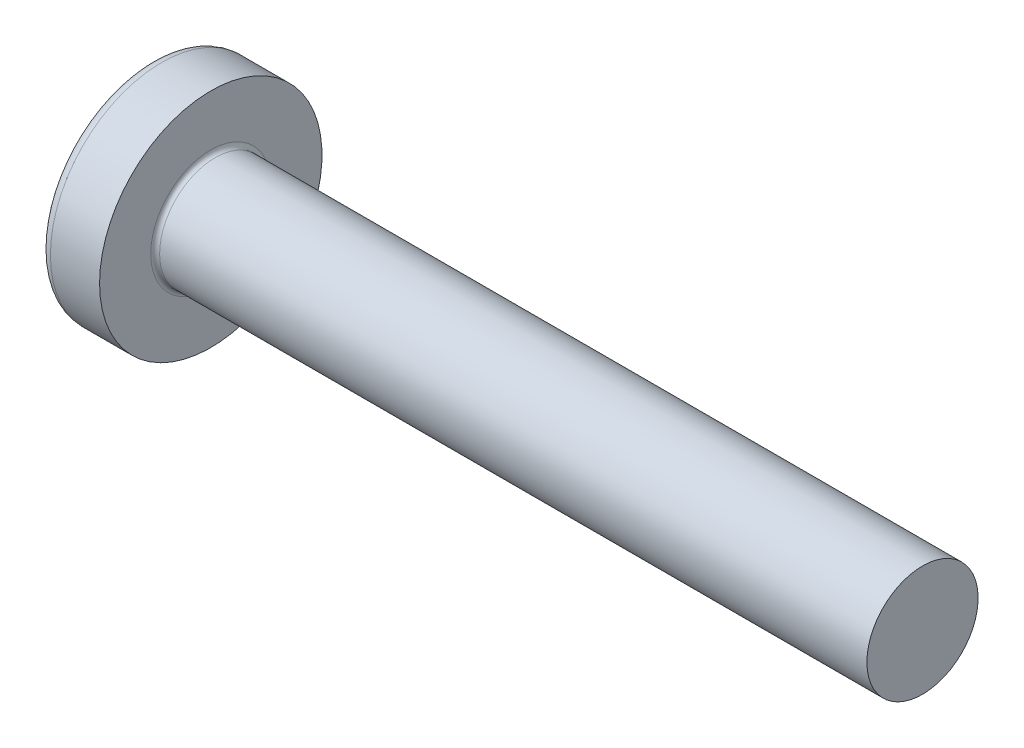
ISO-10303-21;
HEADER;
FILE_DESCRIPTION(('STEP AP214'),'2;1');
FILE_NAME('part.step','',(''),(''),'','','');
FILE_SCHEMA(('AUTOMOTIVE_DESIGN { 1 0 10303 214 1 1 1 1 }'));
ENDSEC;
DATA;
#1=APPLICATION_CONTEXT('core data for automotive mechanical design processes');
#2=APPLICATION_PROTOCOL_DEFINITION('international standard','automotive_design',2000,#1);
#3=PRODUCT_CONTEXT('',#1,'mechanical');
#4=PRODUCT('Part','Part','',(#3));
#5=PRODUCT_RELATED_PRODUCT_CATEGORY('part','',(#4));
#6=PRODUCT_DEFINITION_FORMATION('','',#4);
#7=PRODUCT_DEFINITION_CONTEXT('part definition',#1,'design');
#8=PRODUCT_DEFINITION('design','',#6,#7);
#9=PRODUCT_DEFINITION_SHAPE('','',#8);
#10=(LENGTH_UNIT() NAMED_UNIT(*) SI_UNIT(.MILLI.,.METRE.));
#11=(NAMED_UNIT(*) PLANE_ANGLE_UNIT() SI_UNIT($,.RADIAN.));
#12=(NAMED_UNIT(*) SI_UNIT($,.STERADIAN.) SOLID_ANGLE_UNIT());
#13=UNCERTAINTY_MEASURE_WITH_UNIT(LENGTH_MEASURE(1.E-05),#10,'distance_accuracy_value','');
#14=(GEOMETRIC_REPRESENTATION_CONTEXT(3) GLOBAL_UNCERTAINTY_ASSIGNED_CONTEXT((#13)) GLOBAL_UNIT_ASSIGNED_CONTEXT((#10,
#11,#12)) REPRESENTATION_CONTEXT('',''));
#15=CARTESIAN_POINT('',(0.,0.,0.));
#16=DIRECTION('',(0.,0.,1.));
#17=DIRECTION('',(1.,0.,0.));
#18=AXIS2_PLACEMENT_3D('',#15,#16,#17);
#19=CARTESIAN_POINT('',(4.,0.,0.));
#20=DIRECTION('',(-1.,0.,0.));
#21=DIRECTION('',(0.,1.,0.));
#22=AXIS2_PLACEMENT_3D('',#19,#20,#21);
#23=SPHERICAL_SURFACE('',#22,4.);
#24=CARTESIAN_POINT('',(0.803195914613464,0.,0.));
#25=DIRECTION('',(-1.,0.,0.));
#26=DIRECTION('',(0.,0.,1.));
#27=AXIS2_PLACEMENT_3D('',#24,#25,#26);
#28=CIRCLE('',#27,2.40425531914894);
#29=CARTESIAN_POINT('',(0.803195914613464,0.,2.40425531914894));
#30=VERTEX_POINT('',#29);
#31=EDGE_CURVE('E236',#30,#30,#28,.T.);
#32=ORIENTED_EDGE('',*,*,#31,.T.);
#33=EDGE_LOOP('',(#32));
#34=FACE_BOUND('',#33,.T.);
#35=CARTESIAN_POINT('',(0.0543400780062932,0.,0.));
#36=DIRECTION('',(1.,0.,0.));
#37=DIRECTION('',(0.,0.,-1.));
#38=AXIS2_PLACEMENT_3D('',#35,#36,#37);
#39=CIRCLE('',#38,0.657090389499513);
#40=CARTESIAN_POINT('',(0.0543400780062942,-0.369999999999998,-0.54301729251712));
#41=VERTEX_POINT('',#40);
#42=CARTESIAN_POINT('',(0.0543400780062936,-0.543017292517118,-0.37));
#43=VERTEX_POINT('',#42);
#44=EDGE_CURVE('E372',#41,#43,#39,.F.);
#45=ORIENTED_EDGE('',*,*,#44,.F.);
#46=CARTESIAN_POINT('',(4.,-0.37,0.));
#47=DIRECTION('',(0.,1.,0.));
#48=DIRECTION('',(0.,0.,1.));
#49=AXIS2_PLACEMENT_3D('',#46,#47,#48);
#50=CIRCLE('',#49,3.98285073785097);
#51=CARTESIAN_POINT('',(0.201999107564768,-0.369999999999996,-1.19928696360011));
#52=VERTEX_POINT('',#51);
#53=EDGE_CURVE('E298',#52,#41,#50,.T.);
#54=ORIENTED_EDGE('',*,*,#53,.F.);
#55=CARTESIAN_POINT('',(3.72274316107109,0.,0.556091207572131));
#56=DIRECTION('',(0.446197800778958,0.,-0.894934367749961));
#57=DIRECTION('',(-0.89493436774996,0.,-0.446197800778958));
#58=AXIS2_PLACEMENT_3D('',#55,#56,#57);
#59=CIRCLE('',#58,3.95144166275147);
#60=CARTESIAN_POINT('',(0.201999107564768,0.370000000000004,-1.19928696360011));
#61=VERTEX_POINT('',#60);
#62=EDGE_CURVE('E270',#52,#61,#59,.T.);
#63=ORIENTED_EDGE('',*,*,#62,.T.);
#64=CARTESIAN_POINT('',(4.,0.37,0.));
#65=DIRECTION('',(0.,-1.,0.));
#66=DIRECTION('',(0.,0.,-1.));
#67=AXIS2_PLACEMENT_3D('',#64,#65,#66);
#68=CIRCLE('',#67,3.98285073785097);
#69=CARTESIAN_POINT('',(0.0543400780062943,0.370000000000002,-0.543017292517117));
#70=VERTEX_POINT('',#69);
#71=EDGE_CURVE('E325',#70,#61,#68,.T.);
#72=ORIENTED_EDGE('',*,*,#71,.F.);
#73=CARTESIAN_POINT('',(0.0543400780062936,0.543017292517117,-0.37));
#74=VERTEX_POINT('',#73);
#75=EDGE_CURVE('E391',#74,#70,#39,.F.);
#76=ORIENTED_EDGE('',*,*,#75,.F.);
#77=CARTESIAN_POINT('',(4.,0.,-0.37));
#78=DIRECTION('',(0.,0.,1.));
#79=DIRECTION('',(1.,0.,0.));
#80=AXIS2_PLACEMENT_3D('',#77,#78,#79);
#81=CIRCLE('',#80,3.98285073785097);
#82=CARTESIAN_POINT('',(0.201999107564767,1.19928696360011,-0.37));
#83=VERTEX_POINT('',#82);
#84=EDGE_CURVE('E264',#83,#74,#81,.T.);
#85=ORIENTED_EDGE('',*,*,#84,.F.);
#86=CARTESIAN_POINT('',(3.72274316107109,-0.556091207572131,0.));
#87=DIRECTION('',(0.446197800778958,0.89493436774996,0.));
#88=DIRECTION('',(-0.89493436774996,0.446197800778958,0.));
#89=AXIS2_PLACEMENT_3D('',#86,#87,#88);
#90=CIRCLE('',#89,3.95144166275147);
#91=CARTESIAN_POINT('',(0.201999107564767,1.19928696360011,0.37));
#92=VERTEX_POINT('',#91);
#93=EDGE_CURVE('E267',#83,#92,#90,.T.);
#94=ORIENTED_EDGE('',*,*,#93,.T.);
#95=CARTESIAN_POINT('',(4.,0.,0.37));
#96=DIRECTION('',(0.,0.,-1.));
#97=DIRECTION('',(0.,1.,0.));
#98=AXIS2_PLACEMENT_3D('',#95,#96,#97);
#99=CIRCLE('',#98,3.98285073785097);
#100=CARTESIAN_POINT('',(0.0543400780062936,0.543017292517118,0.37));
#101=VERTEX_POINT('',#100);
#102=EDGE_CURVE('E260',#101,#92,#99,.T.);
#103=ORIENTED_EDGE('',*,*,#102,.F.);
#104=CARTESIAN_POINT('',(0.054340078006295,0.369999999999998,0.54301729251712));
#105=VERTEX_POINT('',#104);
#106=EDGE_CURVE('E390',#105,#101,#39,.F.);
#107=ORIENTED_EDGE('',*,*,#106,.F.);
#108=CARTESIAN_POINT('',(0.201999107564767,0.369999999999996,1.19928696360011));
#109=VERTEX_POINT('',#108);
#110=EDGE_CURVE('E280',#109,#105,#68,.T.);
#111=ORIENTED_EDGE('',*,*,#110,.F.);
#112=CARTESIAN_POINT('',(3.72274316107109,0.,-0.556091207572131));
#113=DIRECTION('',(0.446197800778958,0.,0.89493436774996));
#114=DIRECTION('',(0.89493436774996,0.,-0.446197800778958));
#115=AXIS2_PLACEMENT_3D('',#112,#113,#114);
#116=CIRCLE('',#115,3.95144166275147);
#117=CARTESIAN_POINT('',(0.201999107564767,-0.370000000000004,1.19928696360011));
#118=VERTEX_POINT('',#117);
#119=EDGE_CURVE('E47',#109,#118,#116,.T.);
#120=ORIENTED_EDGE('',*,*,#119,.T.);
#121=CARTESIAN_POINT('',(0.0543400780062935,-0.370000000000002,0.543017292517118));
#122=VERTEX_POINT('',#121);
#123=EDGE_CURVE('E277',#122,#118,#50,.T.);
#124=ORIENTED_EDGE('',*,*,#123,.F.);
#125=CARTESIAN_POINT('',(0.0543400780062936,-0.543017292517118,0.37));
#126=VERTEX_POINT('',#125);
#127=EDGE_CURVE('E426',#126,#122,#39,.F.);
#128=ORIENTED_EDGE('',*,*,#127,.F.);
#129=CARTESIAN_POINT('',(0.201999107564768,-1.19928696360011,0.37));
#130=VERTEX_POINT('',#129);
#131=EDGE_CURVE('E261',#130,#126,#99,.T.);
#132=ORIENTED_EDGE('',*,*,#131,.F.);
#133=CARTESIAN_POINT('',(3.72274316107109,0.55609120757213,0.));
#134=DIRECTION('',(0.446197800778958,-0.894934367749961,0.));
#135=DIRECTION('',(0.89493436774996,0.446197800778958,0.));
#136=AXIS2_PLACEMENT_3D('',#133,#134,#135);
#137=CIRCLE('',#136,3.95144166275147);
#138=CARTESIAN_POINT('',(0.201999107564768,-1.19928696360011,-0.37));
#139=VERTEX_POINT('',#138);
#140=EDGE_CURVE('E257',#130,#139,#137,.T.);
#141=ORIENTED_EDGE('',*,*,#140,.T.);
#142=EDGE_CURVE('E62',#43,#139,#81,.T.);
#143=ORIENTED_EDGE('',*,*,#142,.F.);
#144=EDGE_LOOP('',(#45,#54,#63,#72,#76,#85,#94,#103,#107,#111,#120,#124,#128,#132,#141,#143));
#145=FACE_BOUND('',#144,.T.);
#146=ADVANCED_FACE('F34',(#34,#145),#23,.T.);
#147=CARTESIAN_POINT('',(1.5,0.552127613725262,-0.37));
#148=DIRECTION('',(0.,0.,1.));
#149=DIRECTION('',(1.,0.,0.));
#150=AXIS2_PLACEMENT_3D('',#147,#148,#149);
#151=PLANE('',#150);
#152=ORIENTED_EDGE('',*,*,#84,.T.);
#153=CARTESIAN_POINT('',(-0.98410748766867,0.628943903399942,-0.37));
#154=CARTESIAN_POINT('',(-0.783603343008974,0.612669947295736,-0.37));
#155=CARTESIAN_POINT('',(-0.583110931104086,0.596248129681141,-0.37));
#156=CARTESIAN_POINT('',(-0.182155788452108,0.562989164841715,-0.37));
#157=CARTESIAN_POINT('',(0.0183069414735532,0.546152007726029,-0.37));
#158=CARTESIAN_POINT('',(0.419186928470486,0.511943523152247,-0.37));
#159=CARTESIAN_POINT('',(0.61960418554543,0.4945721957373,-0.37));
#160=CARTESIAN_POINT('',(1.02037173794706,0.459102589125901,-0.37));
#161=CARTESIAN_POINT('',(1.22072203423871,0.441004320904958,-0.37));
#162=CARTESIAN_POINT('',(1.53631168775258,0.411665443099266,-0.37));
#163=CARTESIAN_POINT('',(1.65158348734209,0.400774467003839,-0.37));
#164=CARTESIAN_POINT('',(1.88208360561815,0.378547148308018,-0.37));
#165=CARTESIAN_POINT('',(1.99731192452822,0.367210808029326,-0.37));
#166=CARTESIAN_POINT('',(2.22771614129237,0.343963614894723,-0.37));
#167=CARTESIAN_POINT('',(2.34289203669079,0.332052737461392,-0.37));
#168=CARTESIAN_POINT('',(2.5731581934851,0.307413208767371,-0.37));
#169=CARTESIAN_POINT('',(2.68824845325022,0.294684542317204,-0.37));
#170=CARTESIAN_POINT('',(2.80327961663798,0.281425340988554,-0.37));
#171=B_SPLINE_CURVE_WITH_KNOTS('',3,(#153,#154,#155,#156,#157,#158,#159,#160,#161,#162,#163,
#164,#165,#166,#167,#168,#169,#170),.UNSPECIFIED.,.F.,.F.,(4,2,2,2,2,2,2,2,4),(0.,
0.603490856265068,1.20699609790343,1.81050129079257,2.41399737525255,2.7613521432415,
3.1087051006963,3.45607293033825,3.80344721379854),.UNSPECIFIED.);
#172=CARTESIAN_POINT('',(1.5,0.415013252800437,-0.370000000000001));
#173=VERTEX_POINT('',#172);
#174=EDGE_CURVE('E412',#74,#173,#171,.T.);
#175=ORIENTED_EDGE('',*,*,#174,.T.);
#176=DIRECTION('',(0.,1.,0.));
#177=VECTOR('',#176,1.);
#178=CARTESIAN_POINT('',(1.5,-0.552127613725262,-0.37));
#179=LINE('',#178,#177);
#180=CARTESIAN_POINT('',(1.5,0.552127613725262,-0.37));
#181=VERTEX_POINT('',#180);
#182=EDGE_CURVE('E354',#173,#181,#179,.T.);
#183=ORIENTED_EDGE('',*,*,#182,.T.);
#184=DIRECTION('',(0.89493436774996,-0.446197800778958,0.));
#185=VECTOR('',#184,1.);
#186=CARTESIAN_POINT('',(0.,1.3,-0.37));
#187=LINE('',#186,#185);
#188=EDGE_CURVE('E237',#83,#181,#187,.T.);
#189=ORIENTED_EDGE('',*,*,#188,.F.);
#190=EDGE_LOOP('',(#152,#175,#183,#189));
#191=FACE_BOUND('',#190,.T.);
#192=ADVANCED_FACE('F192',(#191),#151,.T.);
#193=CARTESIAN_POINT('',(1.5,-0.552127613725262,-0.37));
#194=VERTEX_POINT('',#193);
#195=CARTESIAN_POINT('',(1.5,-0.415013252800437,-0.370000000000001));
#196=VERTEX_POINT('',#195);
#197=EDGE_CURVE('E245',#194,#196,#179,.T.);
#198=ORIENTED_EDGE('',*,*,#197,.T.);
#199=CARTESIAN_POINT('',(-0.98410748766867,-0.628943903399942,-0.37));
#200=CARTESIAN_POINT('',(-0.783603343008974,-0.612669947295736,-0.37));
#201=CARTESIAN_POINT('',(-0.583110931104086,-0.596248129681141,-0.37));
#202=CARTESIAN_POINT('',(-0.182155788452109,-0.562989164841715,-0.37));
#203=CARTESIAN_POINT('',(0.0183069414735524,-0.546152007726029,-0.37));
#204=CARTESIAN_POINT('',(0.419186928470486,-0.511943523152247,-0.37));
#205=CARTESIAN_POINT('',(0.619604185545429,-0.4945721957373,-0.37));
#206=CARTESIAN_POINT('',(1.02037173794705,-0.459102589125901,-0.37));
#207=CARTESIAN_POINT('',(1.22072203423871,-0.441004320904958,-0.37));
#208=CARTESIAN_POINT('',(1.53631168775258,-0.411665443099266,-0.37));
#209=CARTESIAN_POINT('',(1.65158348734209,-0.400774467003839,-0.37));
#210=CARTESIAN_POINT('',(1.88208360561815,-0.378547148308018,-0.37));
#211=CARTESIAN_POINT('',(1.99731192452822,-0.367210808029326,-0.37));
#212=CARTESIAN_POINT('',(2.22771614129237,-0.343963614894723,-0.37));
#213=CARTESIAN_POINT('',(2.34289203669079,-0.332052737461392,-0.37));
#214=CARTESIAN_POINT('',(2.5731581934851,-0.30741320876737,-0.37));
#215=CARTESIAN_POINT('',(2.68824845325022,-0.294684542317204,-0.37));
#216=CARTESIAN_POINT('',(2.80327961663798,-0.281425340988554,-0.37));
#217=B_SPLINE_CURVE_WITH_KNOTS('',3,(#199,#200,#201,#202,#203,#204,#205,#206,#207,#208,#209,
#210,#211,#212,#213,#214,#215,#216),.UNSPECIFIED.,.F.,.F.,(4,2,2,2,2,2,2,2,4),(0.,
0.603490856265068,1.20699609790343,1.81050129079257,2.41399737525255,2.7613521432415,
3.1087051006963,3.45607293033825,3.80344721379854),.UNSPECIFIED.);
#218=EDGE_CURVE('E389',#196,#43,#217,.F.);
#219=ORIENTED_EDGE('',*,*,#218,.T.);
#220=ORIENTED_EDGE('',*,*,#142,.T.);
#221=DIRECTION('',(0.89493436774996,0.446197800778958,0.));
#222=VECTOR('',#221,1.);
#223=CARTESIAN_POINT('',(0.,-1.3,-0.37));
#224=LINE('',#223,#222);
#225=EDGE_CURVE('E328',#139,#194,#224,.T.);
#226=ORIENTED_EDGE('',*,*,#225,.T.);
#227=EDGE_LOOP('',(#198,#219,#220,#226));
#228=FACE_BOUND('',#227,.T.);
#229=ADVANCED_FACE('F198',(#228),#151,.T.);
#230=CARTESIAN_POINT('',(1.5,-0.552127613725262,0.37));
#231=DIRECTION('',(0.,0.,-1.));
#232=DIRECTION('',(0.,1.,0.));
#233=AXIS2_PLACEMENT_3D('',#230,#231,#232);
#234=PLANE('',#233);
#235=DIRECTION('',(0.,-1.,0.));
#236=VECTOR('',#235,1.);
#237=CARTESIAN_POINT('',(1.5,0.552127613725262,0.37));
#238=LINE('',#237,#236);
#239=CARTESIAN_POINT('',(1.5,0.552127613725262,0.37));
#240=VERTEX_POINT('',#239);
#241=CARTESIAN_POINT('',(1.5,0.415013252800437,0.370000000000001));
#242=VERTEX_POINT('',#241);
#243=EDGE_CURVE('E337',#240,#242,#238,.T.);
#244=ORIENTED_EDGE('',*,*,#243,.T.);
#245=CARTESIAN_POINT('',(-0.984107487670368,0.62894390340008,0.37));
#246=CARTESIAN_POINT('',(-0.783603343010498,0.61266994729586,0.37));
#247=CARTESIAN_POINT('',(-0.583110931105435,0.596248129681252,0.37));
#248=CARTESIAN_POINT('',(-0.18215578845311,0.562989164841799,0.37));
#249=CARTESIAN_POINT('',(0.0183069414727265,0.546152007726099,0.37));
#250=CARTESIAN_POINT('',(0.419186928470242,0.511943523152269,0.37));
#251=CARTESIAN_POINT('',(0.619604185545593,0.494572195737286,0.37));
#252=CARTESIAN_POINT('',(1.02037173794803,0.459102589125813,0.37));
#253=CARTESIAN_POINT('',(1.22072203424009,0.441004320904832,0.37));
#254=CARTESIAN_POINT('',(1.53631168775438,0.411665443099097,0.37));
#255=CARTESIAN_POINT('',(1.65158348734389,0.400774467003668,0.37));
#256=CARTESIAN_POINT('',(1.88208360561995,0.378547148307843,0.37));
#257=CARTESIAN_POINT('',(1.99731192453001,0.367210808029148,0.37));
#258=CARTESIAN_POINT('',(2.22771614129417,0.343963614894539,0.37));
#259=CARTESIAN_POINT('',(2.34289203669258,0.332052737461204,0.37));
#260=CARTESIAN_POINT('',(2.57315819348689,0.307413208767174,0.37));
#261=CARTESIAN_POINT('',(2.68824845325202,0.294684542317003,0.37));
#262=CARTESIAN_POINT('',(2.80327961663977,0.281425340988347,0.37));
#263=B_SPLINE_CURVE_WITH_KNOTS('',3,(#245,#246,#247,#248,#249,#250,#251,#252,#253,#254,#255,
#256,#257,#258,#259,#260,#261,#262),.UNSPECIFIED.,.F.,.F.,(4,2,2,2,2,2,2,2,4),(0.,
0.603490856265593,1.20699609790448,1.81050129079485,2.41399737525605,2.76135214324501,
3.1087051006998,3.45607293034176,3.80344721380205),.UNSPECIFIED.);
#264=EDGE_CURVE('E664',#242,#101,#263,.F.);
#265=ORIENTED_EDGE('',*,*,#264,.T.);
#266=ORIENTED_EDGE('',*,*,#102,.T.);
#267=DIRECTION('',(0.89493436774996,-0.446197800778958,0.));
#268=VECTOR('',#267,1.);
#269=CARTESIAN_POINT('',(0.,1.3,0.37));
#270=LINE('',#269,#268);
#271=EDGE_CURVE('E242',#92,#240,#270,.T.);
#272=ORIENTED_EDGE('',*,*,#271,.T.);
#273=EDGE_LOOP('',(#244,#265,#266,#272));
#274=FACE_BOUND('',#273,.T.);
#275=ADVANCED_FACE('F408',(#274),#234,.T.);
#276=ORIENTED_EDGE('',*,*,#131,.T.);
#277=CARTESIAN_POINT('',(-0.984107487670367,-0.62894390340008,0.37));
#278=CARTESIAN_POINT('',(-0.783603343010497,-0.61266994729586,0.37));
#279=CARTESIAN_POINT('',(-0.583110931105435,-0.596248129681252,0.37));
#280=CARTESIAN_POINT('',(-0.182155788453109,-0.562989164841799,0.37));
#281=CARTESIAN_POINT('',(0.0183069414727271,-0.546152007726099,0.37));
#282=CARTESIAN_POINT('',(0.419186928470243,-0.511943523152269,0.37));
#283=CARTESIAN_POINT('',(0.619604185545594,-0.494572195737286,0.37));
#284=CARTESIAN_POINT('',(1.02037173794803,-0.459102589125813,0.37));
#285=CARTESIAN_POINT('',(1.2207220342401,-0.441004320904833,0.37));
#286=CARTESIAN_POINT('',(1.53631168775438,-0.411665443099097,0.37));
#287=CARTESIAN_POINT('',(1.65158348734389,-0.400774467003668,0.37));
#288=CARTESIAN_POINT('',(1.88208360561995,-0.378547148307843,0.37));
#289=CARTESIAN_POINT('',(1.99731192453001,-0.367210808029148,0.37));
#290=CARTESIAN_POINT('',(2.22771614129417,-0.343963614894539,0.37));
#291=CARTESIAN_POINT('',(2.34289203669258,-0.332052737461204,0.37));
#292=CARTESIAN_POINT('',(2.57315819348689,-0.307413208767175,0.37));
#293=CARTESIAN_POINT('',(2.68824845325201,-0.294684542317003,0.37));
#294=CARTESIAN_POINT('',(2.80327961663977,-0.281425340988347,0.37));
#295=B_SPLINE_CURVE_WITH_KNOTS('',3,(#277,#278,#279,#280,#281,#282,#283,#284,#285,#286,#287,
#288,#289,#290,#291,#292,#293,#294),.UNSPECIFIED.,.F.,.F.,(4,2,2,2,2,2,2,2,4),(0.,
0.603490856265592,1.20699609790448,1.81050129079485,2.41399737525605,2.76135214324501,
3.1087051006998,3.45607293034176,3.80344721380205),.UNSPECIFIED.);
#296=CARTESIAN_POINT('',(1.5,-0.415013252800437,0.370000000000001));
#297=VERTEX_POINT('',#296);
#298=EDGE_CURVE('E427',#126,#297,#295,.T.);
#299=ORIENTED_EDGE('',*,*,#298,.T.);
#300=CARTESIAN_POINT('',(1.5,-0.552127613725262,0.37));
#301=VERTEX_POINT('',#300);
#302=EDGE_CURVE('E339',#297,#301,#238,.T.);
#303=ORIENTED_EDGE('',*,*,#302,.T.);
#304=DIRECTION('',(0.89493436774996,0.446197800778958,0.));
#305=VECTOR('',#304,1.);
#306=CARTESIAN_POINT('',(0.,-1.3,0.37));
#307=LINE('',#306,#305);
#308=EDGE_CURVE('E330',#130,#301,#307,.T.);
#309=ORIENTED_EDGE('',*,*,#308,.F.);
#310=EDGE_LOOP('',(#276,#299,#303,#309));
#311=FACE_BOUND('',#310,.T.);
#312=ADVANCED_FACE('F518',(#311),#234,.T.);
#313=CARTESIAN_POINT('',(1.5,0.552127613725262,0.37));
#314=DIRECTION('',(0.446197800778958,0.89493436774996,0.));
#315=DIRECTION('',(-0.89493436774996,0.446197800778958,0.));
#316=AXIS2_PLACEMENT_3D('',#313,#314,#315);
#317=PLANE('',#316);
#318=CARTESIAN_POINT('',(2.47007520981164,0.0684659723733946,0.));
#319=DIRECTION('',(0.446197800778958,0.89493436774996,0.));
#320=DIRECTION('',(-0.89493436774996,0.446197800778958,0.));
#321=AXIS2_PLACEMENT_3D('',#318,#319,#320);
#322=ELLIPSE('',#321,1.09405678911959,0.483340660124242);
#323=CARTESIAN_POINT('',(1.5,0.552127613725263,0.0655064741994742));
#324=VERTEX_POINT('',#323);
#325=CARTESIAN_POINT('',(1.5,0.552127613725263,-0.0655064741994742));
#326=VERTEX_POINT('',#325);
#327=EDGE_CURVE('E303',#324,#326,#322,.F.);
#328=ORIENTED_EDGE('',*,*,#327,.F.);
#329=DIRECTION('',(0.,0.,-1.));
#330=VECTOR('',#329,1.);
#331=CARTESIAN_POINT('',(1.5,0.552127613725262,0.37));
#332=LINE('',#331,#330);
#333=EDGE_CURVE('E340',#240,#324,#332,.T.);
#334=ORIENTED_EDGE('',*,*,#333,.F.);
#335=ORIENTED_EDGE('',*,*,#271,.F.);
#336=ORIENTED_EDGE('',*,*,#93,.F.);
#337=ORIENTED_EDGE('',*,*,#188,.T.);
#338=EDGE_CURVE('E342',#326,#181,#332,.T.);
#339=ORIENTED_EDGE('',*,*,#338,.F.);
#340=EDGE_LOOP('',(#328,#334,#335,#336,#337,#339));
#341=FACE_BOUND('',#340,.T.);
#342=ADVANCED_FACE('F406',(#341),#317,.F.);
#343=CARTESIAN_POINT('',(0.,-1.3,-0.37));
#344=DIRECTION('',(0.446197800778958,-0.894934367749961,0.));
#345=DIRECTION('',(0.89493436774996,0.446197800778958,0.));
#346=AXIS2_PLACEMENT_3D('',#343,#344,#345);
#347=PLANE('',#346);
#348=CARTESIAN_POINT('',(2.47007520981164,-0.0684659723733947,0.));
#349=DIRECTION('',(0.446197800778958,-0.894934367749961,0.));
#350=DIRECTION('',(-0.89493436774996,-0.446197800778958,0.));
#351=AXIS2_PLACEMENT_3D('',#348,#349,#350);
#352=ELLIPSE('',#351,1.09405678911959,0.483340660124243);
#353=CARTESIAN_POINT('',(1.5,-0.552127613725263,-0.0655064741994743));
#354=VERTEX_POINT('',#353);
#355=CARTESIAN_POINT('',(1.5,-0.552127613725263,0.0655064741994741));
#356=VERTEX_POINT('',#355);
#357=EDGE_CURVE('E666',#354,#356,#352,.F.);
#358=ORIENTED_EDGE('',*,*,#357,.F.);
#359=DIRECTION('',(0.,0.,1.));
#360=VECTOR('',#359,1.);
#361=CARTESIAN_POINT('',(1.5,-0.552127613725262,-0.37));
#362=LINE('',#361,#360);
#363=EDGE_CURVE('E333',#194,#354,#362,.T.);
#364=ORIENTED_EDGE('',*,*,#363,.F.);
#365=ORIENTED_EDGE('',*,*,#225,.F.);
#366=ORIENTED_EDGE('',*,*,#140,.F.);
#367=ORIENTED_EDGE('',*,*,#308,.T.);
#368=EDGE_CURVE('E336',#356,#301,#362,.T.);
#369=ORIENTED_EDGE('',*,*,#368,.F.);
#370=EDGE_LOOP('',(#358,#364,#365,#366,#367,#369));
#371=FACE_BOUND('',#370,.T.);
#372=ADVANCED_FACE('F505',(#371),#347,.F.);
#373=CARTESIAN_POINT('',(1.5,0.552127613725262,-0.37));
#374=DIRECTION('',(-1.,0.,0.));
#375=DIRECTION('',(0.,0.,1.));
#376=AXIS2_PLACEMENT_3D('',#373,#374,#375);
#377=PLANE('',#376);
#378=DIRECTION('',(0.,1.,0.));
#379=VECTOR('',#378,1.);
#380=CARTESIAN_POINT('',(1.5,-0.370000000000002,0.552127613725261));
#381=LINE('',#380,#379);
#382=CARTESIAN_POINT('',(1.5,-0.370000000000002,0.552127613725261));
#383=VERTEX_POINT('',#382);
#384=CARTESIAN_POINT('',(1.5,-0.0655064741994869,0.552127613725262));
#385=VERTEX_POINT('',#384);
#386=EDGE_CURVE('E318',#383,#385,#381,.T.);
#387=ORIENTED_EDGE('',*,*,#386,.T.);
#388=CARTESIAN_POINT('',(1.5,0.,0.));
#389=DIRECTION('',(-1.,0.,0.));
#390=DIRECTION('',(0.,0.,1.));
#391=AXIS2_PLACEMENT_3D('',#388,#389,#390);
#392=CIRCLE('',#391,0.556);
#393=CARTESIAN_POINT('',(1.5,-0.370000000000001,0.415013252800436));
#394=VERTEX_POINT('',#393);
#395=EDGE_CURVE('E692',#394,#385,#392,.T.);
#396=ORIENTED_EDGE('',*,*,#395,.F.);
#397=DIRECTION('',(0.,0.,-1.));
#398=VECTOR('',#397,1.);
#399=CARTESIAN_POINT('',(1.5,-0.370000000000002,0.552127613725261));
#400=LINE('',#399,#398);
#401=EDGE_CURVE('E314',#383,#394,#400,.T.);
#402=ORIENTED_EDGE('',*,*,#401,.F.);
#403=EDGE_LOOP('',(#387,#396,#402));
#404=FACE_BOUND('',#403,.T.);
#405=ADVANCED_FACE('F462',(#404),#377,.T.);
#406=ORIENTED_EDGE('',*,*,#302,.F.);
#407=EDGE_CURVE('E697',#356,#297,#392,.T.);
#408=ORIENTED_EDGE('',*,*,#407,.F.);
#409=ORIENTED_EDGE('',*,*,#368,.T.);
#410=EDGE_LOOP('',(#406,#408,#409));
#411=FACE_BOUND('',#410,.T.);
#412=ADVANCED_FACE('F492',(#411),#377,.T.);
#413=ORIENTED_EDGE('',*,*,#363,.T.);
#414=EDGE_CURVE('E383',#196,#354,#392,.T.);
#415=ORIENTED_EDGE('',*,*,#414,.F.);
#416=ORIENTED_EDGE('',*,*,#197,.F.);
#417=EDGE_LOOP('',(#413,#415,#416));
#418=FACE_BOUND('',#417,.T.);
#419=ADVANCED_FACE('F486',(#418),#377,.T.);
#420=CARTESIAN_POINT('',(1.5,-0.369999999999998,-0.415013252800437));
#421=VERTEX_POINT('',#420);
#422=CARTESIAN_POINT('',(1.5,-0.369999999999998,-0.552127613725263));
#423=VERTEX_POINT('',#422);
#424=EDGE_CURVE('E317',#421,#423,#400,.T.);
#425=ORIENTED_EDGE('',*,*,#424,.F.);
#426=CARTESIAN_POINT('',(1.5,-0.065506474199485,-0.552127613725262));
#427=VERTEX_POINT('',#426);
#428=EDGE_CURVE('E54',#427,#421,#392,.T.);
#429=ORIENTED_EDGE('',*,*,#428,.F.);
#430=DIRECTION('',(0.,-1.,0.));
#431=VECTOR('',#430,1.);
#432=CARTESIAN_POINT('',(1.5,0.370000000000002,-0.552127613725261));
#433=LINE('',#432,#431);
#434=EDGE_CURVE('E313',#427,#423,#433,.T.);
#435=ORIENTED_EDGE('',*,*,#434,.T.);
#436=EDGE_LOOP('',(#425,#429,#435));
#437=FACE_BOUND('',#436,.T.);
#438=ADVANCED_FACE('F378',(#437),#377,.T.);
#439=CARTESIAN_POINT('',(1.5,0.370000000000002,-0.552127613725261));
#440=VERTEX_POINT('',#439);
#441=CARTESIAN_POINT('',(1.5,0.0655064741994889,-0.552127613725262));
#442=VERTEX_POINT('',#441);
#443=EDGE_CURVE('E310',#440,#442,#433,.T.);
#444=ORIENTED_EDGE('',*,*,#443,.T.);
#445=CARTESIAN_POINT('',(1.5,0.370000000000001,-0.415013252800436));
#446=VERTEX_POINT('',#445);
#447=EDGE_CURVE('E382',#446,#442,#392,.T.);
#448=ORIENTED_EDGE('',*,*,#447,.F.);
#449=DIRECTION('',(0.,0.,1.));
#450=VECTOR('',#449,1.);
#451=CARTESIAN_POINT('',(1.5,0.370000000000002,-0.552127613725261));
#452=LINE('',#451,#450);
#453=EDGE_CURVE('E322',#440,#446,#452,.T.);
#454=ORIENTED_EDGE('',*,*,#453,.F.);
#455=EDGE_LOOP('',(#444,#448,#454));
#456=FACE_BOUND('',#455,.T.);
#457=ADVANCED_FACE('F474',(#456),#377,.T.);
#458=ORIENTED_EDGE('',*,*,#182,.F.);
#459=EDGE_CURVE('E681',#326,#173,#392,.T.);
#460=ORIENTED_EDGE('',*,*,#459,.F.);
#461=ORIENTED_EDGE('',*,*,#338,.T.);
#462=EDGE_LOOP('',(#458,#460,#461));
#463=FACE_BOUND('',#462,.T.);
#464=ADVANCED_FACE('F468',(#463),#377,.T.);
#465=ORIENTED_EDGE('',*,*,#333,.T.);
#466=EDGE_CURVE('E683',#242,#324,#392,.T.);
#467=ORIENTED_EDGE('',*,*,#466,.F.);
#468=ORIENTED_EDGE('',*,*,#243,.F.);
#469=EDGE_LOOP('',(#465,#467,#468));
#470=FACE_BOUND('',#469,.T.);
#471=ADVANCED_FACE('F460',(#470),#377,.T.);
#472=CARTESIAN_POINT('',(1.5,0.369999999999999,0.415013252800439));
#473=VERTEX_POINT('',#472);
#474=CARTESIAN_POINT('',(1.5,0.369999999999998,0.552127613725263));
#475=VERTEX_POINT('',#474);
#476=EDGE_CURVE('E295',#473,#475,#452,.T.);
#477=ORIENTED_EDGE('',*,*,#476,.F.);
#478=CARTESIAN_POINT('',(1.5,0.065506474199483,0.552127613725262));
#479=VERTEX_POINT('',#478);
#480=EDGE_CURVE('E384',#479,#473,#392,.T.);
#481=ORIENTED_EDGE('',*,*,#480,.F.);
#482=EDGE_CURVE('E321',#479,#475,#381,.T.);
#483=ORIENTED_EDGE('',*,*,#482,.T.);
#484=EDGE_LOOP('',(#477,#481,#483));
#485=FACE_BOUND('',#484,.T.);
#486=ADVANCED_FACE('F454',(#485),#377,.T.);
#487=CARTESIAN_POINT('',(1.5,0.369999999999998,0.552127613725263));
#488=DIRECTION('',(0.,-1.,0.));
#489=DIRECTION('',(1.,0.,0.));
#490=AXIS2_PLACEMENT_3D('',#487,#488,#489);
#491=PLANE('',#490);
#492=ORIENTED_EDGE('',*,*,#110,.T.);
#493=CARTESIAN_POINT('',(-0.984107487670368,0.369999999999998,0.628943903400081));
#494=CARTESIAN_POINT('',(-0.783603343010498,0.369999999999998,0.612669947295861));
#495=CARTESIAN_POINT('',(-0.583110931105436,0.369999999999998,0.596248129681253));
#496=CARTESIAN_POINT('',(-0.18215578845311,0.369999999999998,0.5629891648418));
#497=CARTESIAN_POINT('',(0.0183069414727262,0.369999999999998,0.546152007726101));
#498=CARTESIAN_POINT('',(0.419186928470242,0.369999999999998,0.51194352315227));
#499=CARTESIAN_POINT('',(0.619604185545594,0.369999999999998,0.494572195737287));
#500=CARTESIAN_POINT('',(1.02037173794803,0.369999999999998,0.459102589125815));
#501=CARTESIAN_POINT('',(1.2207220342401,0.369999999999998,0.441004320904834));
#502=CARTESIAN_POINT('',(1.53631168775438,0.369999999999998,0.411665443099098));
#503=CARTESIAN_POINT('',(1.65158348734389,0.369999999999999,0.40077446700367));
#504=CARTESIAN_POINT('',(1.88208360561995,0.369999999999999,0.378547148307844));
#505=CARTESIAN_POINT('',(1.99731192453001,0.369999999999999,0.367210808029149));
#506=CARTESIAN_POINT('',(2.22771614129417,0.369999999999999,0.343963614894541));
#507=CARTESIAN_POINT('',(2.34289203669258,0.369999999999999,0.332052737461206));
#508=CARTESIAN_POINT('',(2.57315819348689,0.369999999999999,0.307413208767176));
#509=CARTESIAN_POINT('',(2.68824845325201,0.369999999999999,0.294684542317004));
#510=CARTESIAN_POINT('',(2.80327961663977,0.369999999999999,0.281425340988348));
#511=B_SPLINE_CURVE_WITH_KNOTS('',3,(#493,#494,#495,#496,#497,#498,#499,#500,#501,#502,#503,
#504,#505,#506,#507,#508,#509,#510),.UNSPECIFIED.,.F.,.F.,(4,2,2,2,2,2,2,2,4),(0.,
0.603490856265592,1.20699609790448,1.81050129079485,2.41399737525605,2.76135214324501,
3.1087051006998,3.45607293034176,3.80344721380205),.UNSPECIFIED.);
#512=EDGE_CURVE('E663',#105,#473,#511,.T.);
#513=ORIENTED_EDGE('',*,*,#512,.T.);
#514=ORIENTED_EDGE('',*,*,#476,.T.);
#515=DIRECTION('',(0.89493436774996,0.,-0.446197800778958));
#516=VECTOR('',#515,1.);
#517=CARTESIAN_POINT('',(0.,0.369999999999995,1.3));
#518=LINE('',#517,#516);
#519=EDGE_CURVE('E288',#109,#475,#518,.T.);
#520=ORIENTED_EDGE('',*,*,#519,.F.);
#521=EDGE_LOOP('',(#492,#513,#514,#520));
#522=FACE_BOUND('',#521,.T.);
#523=ADVANCED_FACE('F292',(#522),#491,.T.);
#524=CARTESIAN_POINT('',(1.5,-0.369999999999998,-0.552127613725263));
#525=DIRECTION('',(0.,1.,0.));
#526=DIRECTION('',(0.,0.,1.));
#527=AXIS2_PLACEMENT_3D('',#524,#525,#526);
#528=PLANE('',#527);
#529=ORIENTED_EDGE('',*,*,#401,.T.);
#530=CARTESIAN_POINT('',(-0.98410748766867,-0.370000000000002,0.62894390339994));
#531=CARTESIAN_POINT('',(-0.783603343008974,-0.370000000000002,0.612669947295735));
#532=CARTESIAN_POINT('',(-0.583110931104086,-0.370000000000002,0.59624812968114));
#533=CARTESIAN_POINT('',(-0.182155788452109,-0.370000000000002,0.562989164841714));
#534=CARTESIAN_POINT('',(0.0183069414735528,-0.370000000000002,0.546152007726028));
#535=CARTESIAN_POINT('',(0.419186928470486,-0.370000000000002,0.511943523152246));
#536=CARTESIAN_POINT('',(0.61960418554543,-0.370000000000002,0.494572195737299));
#537=CARTESIAN_POINT('',(1.02037173794706,-0.370000000000001,0.459102589125899));
#538=CARTESIAN_POINT('',(1.22072203423871,-0.370000000000001,0.441004320904957));
#539=CARTESIAN_POINT('',(1.53631168775258,-0.370000000000001,0.411665443099264));
#540=CARTESIAN_POINT('',(1.65158348734209,-0.370000000000001,0.400774467003838));
#541=CARTESIAN_POINT('',(1.88208360561815,-0.370000000000001,0.378547148308017));
#542=CARTESIAN_POINT('',(1.99731192452822,-0.370000000000001,0.367210808029324));
#543=CARTESIAN_POINT('',(2.22771614129237,-0.370000000000001,0.343963614894722));
#544=CARTESIAN_POINT('',(2.34289203669079,-0.370000000000001,0.33205273746139));
#545=CARTESIAN_POINT('',(2.5731581934851,-0.370000000000001,0.307413208767369));
#546=CARTESIAN_POINT('',(2.68824845325022,-0.370000000000001,0.294684542317202));
#547=CARTESIAN_POINT('',(2.80327961663798,-0.370000000000001,0.281425340988552));
#548=B_SPLINE_CURVE_WITH_KNOTS('',3,(#530,#531,#532,#533,#534,#535,#536,#537,#538,#539,#540,
#541,#542,#543,#544,#545,#546,#547),.UNSPECIFIED.,.F.,.F.,(4,2,2,2,2,2,2,2,4),(0.,
0.603490856265068,1.20699609790343,1.81050129079257,2.41399737525255,2.7613521432415,
3.1087051006963,3.45607293033825,3.80344721379854),.UNSPECIFIED.);
#549=EDGE_CURVE('E420',#394,#122,#548,.F.);
#550=ORIENTED_EDGE('',*,*,#549,.T.);
#551=ORIENTED_EDGE('',*,*,#123,.T.);
#552=DIRECTION('',(0.89493436774996,0.,-0.446197800778958));
#553=VECTOR('',#552,1.);
#554=CARTESIAN_POINT('',(0.,-0.370000000000005,1.3));
#555=LINE('',#554,#553);
#556=EDGE_CURVE('E290',#118,#383,#555,.T.);
#557=ORIENTED_EDGE('',*,*,#556,.T.);
#558=EDGE_LOOP('',(#529,#550,#551,#557));
#559=FACE_BOUND('',#558,.T.);
#560=ADVANCED_FACE('F227',(#559),#528,.T.);
#561=CARTESIAN_POINT('',(1.5,-0.370000000000002,0.552127613725261));
#562=DIRECTION('',(0.446197800778958,0.,0.89493436774996));
#563=DIRECTION('',(-0.89493436774996,0.,0.446197800778958));
#564=AXIS2_PLACEMENT_3D('',#561,#562,#563);
#565=PLANE('',#564);
#566=CARTESIAN_POINT('',(2.47007520981164,0.,0.0684659723733946));
#567=DIRECTION('',(0.446197800778958,0.,0.89493436774996));
#568=DIRECTION('',(-0.89493436774996,0.,0.446197800778958));
#569=AXIS2_PLACEMENT_3D('',#566,#567,#568);
#570=ELLIPSE('',#569,1.09405678911959,0.483340660124242);
#571=EDGE_CURVE('E418',#385,#479,#570,.F.);
#572=ORIENTED_EDGE('',*,*,#571,.F.);
#573=ORIENTED_EDGE('',*,*,#386,.F.);
#574=ORIENTED_EDGE('',*,*,#556,.F.);
#575=ORIENTED_EDGE('',*,*,#119,.F.);
#576=ORIENTED_EDGE('',*,*,#519,.T.);
#577=ORIENTED_EDGE('',*,*,#482,.F.);
#578=EDGE_LOOP('',(#572,#573,#574,#575,#576,#577));
#579=FACE_BOUND('',#578,.T.);
#580=ADVANCED_FACE('F286',(#579),#565,.F.);
#581=CARTESIAN_POINT('',(0.,0.370000000000005,-1.3));
#582=DIRECTION('',(0.446197800778958,0.,-0.894934367749961));
#583=DIRECTION('',(0.89493436774996,0.,0.446197800778958));
#584=AXIS2_PLACEMENT_3D('',#581,#582,#583);
#585=PLANE('',#584);
#586=CARTESIAN_POINT('',(2.47007520981164,0.,-0.0684659723733947));
#587=DIRECTION('',(0.446197800778958,0.,-0.894934367749961));
#588=DIRECTION('',(-0.89493436774996,0.,-0.446197800778958));
#589=AXIS2_PLACEMENT_3D('',#586,#587,#588);
#590=ELLIPSE('',#589,1.09405678911959,0.483340660124243);
#591=EDGE_CURVE('E376',#442,#427,#590,.F.);
#592=ORIENTED_EDGE('',*,*,#591,.F.);
#593=ORIENTED_EDGE('',*,*,#443,.F.);
#594=DIRECTION('',(0.89493436774996,0.,0.446197800778958));
#595=VECTOR('',#594,1.);
#596=CARTESIAN_POINT('',(0.,0.370000000000005,-1.3));
#597=LINE('',#596,#595);
#598=EDGE_CURVE('E300',#61,#440,#597,.T.);
#599=ORIENTED_EDGE('',*,*,#598,.F.);
#600=ORIENTED_EDGE('',*,*,#62,.F.);
#601=DIRECTION('',(0.89493436774996,0.,0.446197800778958));
#602=VECTOR('',#601,1.);
#603=CARTESIAN_POINT('',(0.,-0.369999999999995,-1.3));
#604=LINE('',#603,#602);
#605=EDGE_CURVE('E307',#52,#423,#604,.T.);
#606=ORIENTED_EDGE('',*,*,#605,.T.);
#607=ORIENTED_EDGE('',*,*,#434,.F.);
#608=EDGE_LOOP('',(#592,#593,#599,#600,#606,#607));
#609=FACE_BOUND('',#608,.T.);
#610=ADVANCED_FACE('F367',(#609),#585,.F.);
#611=ORIENTED_EDGE('',*,*,#453,.T.);
#612=CARTESIAN_POINT('',(-0.98410748766867,0.370000000000002,-0.62894390339994));
#613=CARTESIAN_POINT('',(-0.783603343008974,0.370000000000002,-0.612669947295734));
#614=CARTESIAN_POINT('',(-0.583110931104086,0.370000000000002,-0.596248129681139));
#615=CARTESIAN_POINT('',(-0.182155788452108,0.370000000000002,-0.562989164841714));
#616=CARTESIAN_POINT('',(0.0183069414735533,0.370000000000002,-0.546152007726028));
#617=CARTESIAN_POINT('',(0.419186928470486,0.370000000000002,-0.511943523152246));
#618=CARTESIAN_POINT('',(0.61960418554543,0.370000000000002,-0.494572195737299));
#619=CARTESIAN_POINT('',(1.02037173794706,0.370000000000002,-0.459102589125899));
#620=CARTESIAN_POINT('',(1.22072203423871,0.370000000000002,-0.441004320904957));
#621=CARTESIAN_POINT('',(1.53631168775258,0.370000000000001,-0.411665443099264));
#622=CARTESIAN_POINT('',(1.65158348734209,0.370000000000001,-0.400774467003838));
#623=CARTESIAN_POINT('',(1.88208360561816,0.370000000000001,-0.378547148308017));
#624=CARTESIAN_POINT('',(1.99731192452822,0.370000000000001,-0.367210808029324));
#625=CARTESIAN_POINT('',(2.22771614129237,0.370000000000001,-0.343963614894722));
#626=CARTESIAN_POINT('',(2.34289203669079,0.370000000000001,-0.332052737461391));
#627=CARTESIAN_POINT('',(2.5731581934851,0.370000000000001,-0.307413208767369));
#628=CARTESIAN_POINT('',(2.68824845325022,0.370000000000001,-0.294684542317203));
#629=CARTESIAN_POINT('',(2.80327961663798,0.370000000000001,-0.281425340988553));
#630=B_SPLINE_CURVE_WITH_KNOTS('',3,(#612,#613,#614,#615,#616,#617,#618,#619,#620,#621,#622,
#623,#624,#625,#626,#627,#628,#629),.UNSPECIFIED.,.F.,.F.,(4,2,2,2,2,2,2,2,4),(0.,
0.603490856265068,1.20699609790343,1.81050129079257,2.41399737525255,2.7613521432415,
3.1087051006963,3.45607293033825,3.80344721379854),.UNSPECIFIED.);
#631=EDGE_CURVE('E363',#446,#70,#630,.F.);
#632=ORIENTED_EDGE('',*,*,#631,.T.);
#633=ORIENTED_EDGE('',*,*,#71,.T.);
#634=ORIENTED_EDGE('',*,*,#598,.T.);
#635=EDGE_LOOP('',(#611,#632,#633,#634));
#636=FACE_BOUND('',#635,.T.);
#637=ADVANCED_FACE('F225',(#636),#491,.T.);
#638=ORIENTED_EDGE('',*,*,#53,.T.);
#639=CARTESIAN_POINT('',(-0.98410748766867,-0.369999999999997,-0.628943903399943));
#640=CARTESIAN_POINT('',(-0.783603343008974,-0.369999999999998,-0.612669947295737));
#641=CARTESIAN_POINT('',(-0.583110931104086,-0.369999999999998,-0.596248129681142));
#642=CARTESIAN_POINT('',(-0.182155788452109,-0.369999999999998,-0.562989164841716));
#643=CARTESIAN_POINT('',(0.0183069414735524,-0.369999999999998,-0.546152007726031));
#644=CARTESIAN_POINT('',(0.419186928470486,-0.369999999999998,-0.511943523152249));
#645=CARTESIAN_POINT('',(0.619604185545429,-0.369999999999998,-0.494572195737301));
#646=CARTESIAN_POINT('',(1.02037173794705,-0.369999999999998,-0.459102589125902));
#647=CARTESIAN_POINT('',(1.22072203423871,-0.369999999999998,-0.441004320904959));
#648=CARTESIAN_POINT('',(1.53631168775258,-0.369999999999998,-0.411665443099267));
#649=CARTESIAN_POINT('',(1.65158348734209,-0.369999999999998,-0.40077446700384));
#650=CARTESIAN_POINT('',(1.88208360561815,-0.369999999999999,-0.37854714830802));
#651=CARTESIAN_POINT('',(1.99731192452822,-0.369999999999999,-0.367210808029327));
#652=CARTESIAN_POINT('',(2.22771614129237,-0.369999999999999,-0.343963614894724));
#653=CARTESIAN_POINT('',(2.34289203669079,-0.369999999999999,-0.332052737461393));
#654=CARTESIAN_POINT('',(2.5731581934851,-0.369999999999999,-0.307413208767372));
#655=CARTESIAN_POINT('',(2.68824845325022,-0.369999999999999,-0.294684542317205));
#656=CARTESIAN_POINT('',(2.80327961663798,-0.369999999999999,-0.281425340988555));
#657=B_SPLINE_CURVE_WITH_KNOTS('',3,(#639,#640,#641,#642,#643,#644,#645,#646,#647,#648,#649,
#650,#651,#652,#653,#654,#655,#656),.UNSPECIFIED.,.F.,.F.,(4,2,2,2,2,2,2,2,4),(0.,
0.603490856265068,1.20699609790343,1.81050129079257,2.41399737525255,2.7613521432415,
3.1087051006963,3.45607293033825,3.80344721379854),.UNSPECIFIED.);
#658=EDGE_CURVE('E11',#41,#421,#657,.T.);
#659=ORIENTED_EDGE('',*,*,#658,.T.);
#660=ORIENTED_EDGE('',*,*,#424,.T.);
#661=ORIENTED_EDGE('',*,*,#605,.F.);
#662=EDGE_LOOP('',(#638,#659,#660,#661));
#663=FACE_BOUND('',#662,.T.);
#664=ADVANCED_FACE('F220',(#663),#528,.T.);
#665=CARTESIAN_POINT('',(-25.4,0.,0.));
#666=DIRECTION('',(-1.,0.,0.));
#667=DIRECTION('',(0.,0.,1.));
#668=AXIS2_PLACEMENT_3D('',#665,#666,#667);
#669=CYLINDRICAL_SURFACE('',#668,1.25);
#670=CARTESIAN_POINT('',(2.2,0.,0.));
#671=DIRECTION('',(-1.,0.,0.));
#672=DIRECTION('',(0.,0.,1.));
#673=AXIS2_PLACEMENT_3D('',#670,#671,#672);
#674=CIRCLE('',#673,1.25);
#675=CARTESIAN_POINT('',(2.2,0.,1.25));
#676=VERTEX_POINT('',#675);
#677=EDGE_CURVE('E231',#676,#676,#674,.F.);
#678=ORIENTED_EDGE('',*,*,#677,.T.);
#679=EDGE_LOOP('',(#678));
#680=FACE_BOUND('',#679,.T.);
#681=CARTESIAN_POINT('',(18.1,0.,0.));
#682=DIRECTION('',(-1.,0.,0.));
#683=DIRECTION('',(0.,0.,1.));
#684=AXIS2_PLACEMENT_3D('',#681,#682,#683);
#685=CIRCLE('',#684,1.25);
#686=CARTESIAN_POINT('',(18.1,0.,1.25));
#687=VERTEX_POINT('',#686);
#688=EDGE_CURVE('E234',#687,#687,#685,.T.);
#689=ORIENTED_EDGE('',*,*,#688,.T.);
#690=EDGE_LOOP('',(#689));
#691=FACE_BOUND('',#690,.T.);
#692=ADVANCED_FACE('F217',(#680,#691),#669,.T.);
#693=CARTESIAN_POINT('',(2.1,1.25,0.));
#694=DIRECTION('',(-1.,0.,0.));
#695=DIRECTION('',(0.,0.,1.));
#696=AXIS2_PLACEMENT_3D('',#693,#694,#695);
#697=PLANE('',#696);
#698=CARTESIAN_POINT('',(2.1,0.,0.));
#699=DIRECTION('',(-1.,0.,0.));
#700=DIRECTION('',(0.,0.,1.));
#701=AXIS2_PLACEMENT_3D('',#698,#699,#700);
#702=CIRCLE('',#701,1.35);
#703=CARTESIAN_POINT('',(2.1,0.,1.35));
#704=VERTEX_POINT('',#703);
#705=EDGE_CURVE('E253',#704,#704,#702,.T.);
#706=ORIENTED_EDGE('',*,*,#705,.T.);
#707=EDGE_LOOP('',(#706));
#708=FACE_BOUND('',#707,.T.);
#709=CARTESIAN_POINT('',(2.1,0.,0.));
#710=DIRECTION('',(-1.,0.,0.));
#711=DIRECTION('',(0.,0.,1.));
#712=AXIS2_PLACEMENT_3D('',#709,#710,#711);
#713=CIRCLE('',#712,2.5);
#714=CARTESIAN_POINT('',(2.1,0.,2.5));
#715=VERTEX_POINT('',#714);
#716=EDGE_CURVE('E250',#715,#715,#713,.T.);
#717=ORIENTED_EDGE('',*,*,#716,.F.);
#718=EDGE_LOOP('',(#717));
#719=FACE_BOUND('',#718,.T.);
#720=ADVANCED_FACE('F214',(#708,#719),#697,.F.);
#721=CARTESIAN_POINT('',(-25.4,0.,0.));
#722=DIRECTION('',(-1.,0.,0.));
#723=DIRECTION('',(0.,0.,1.));
#724=AXIS2_PLACEMENT_3D('',#721,#722,#723);
#725=CYLINDRICAL_SURFACE('',#724,2.5);
#726=ORIENTED_EDGE('',*,*,#716,.T.);
#727=EDGE_LOOP('',(#726));
#728=FACE_BOUND('',#727,.T.);
#729=CARTESIAN_POINT('',(0.995004159736655,0.,0.));
#730=DIRECTION('',(-1.,0.,0.));
#731=DIRECTION('',(0.,0.,1.));
#732=AXIS2_PLACEMENT_3D('',#729,#730,#731);
#733=CIRCLE('',#732,2.5);
#734=CARTESIAN_POINT('',(0.995004159736655,0.,2.5));
#735=VERTEX_POINT('',#734);
#736=EDGE_CURVE('E239',#735,#735,#733,.T.);
#737=ORIENTED_EDGE('',*,*,#736,.F.);
#738=EDGE_LOOP('',(#737));
#739=FACE_BOUND('',#738,.T.);
#740=ADVANCED_FACE('F210',(#728,#739),#725,.T.);
#741=CARTESIAN_POINT('',(0.995004159736656,0.,0.));
#742=DIRECTION('',(-1.,0.,0.));
#743=DIRECTION('',(0.,0.,1.));
#744=AXIS2_PLACEMENT_3D('',#741,#742,#743);
#745=TOROIDAL_SURFACE('',#744,2.26,0.24);
#746=ORIENTED_EDGE('',*,*,#736,.T.);
#747=EDGE_LOOP('',(#746));
#748=FACE_BOUND('',#747,.T.);
#749=ORIENTED_EDGE('',*,*,#31,.F.);
#750=EDGE_LOOP('',(#749));
#751=FACE_BOUND('',#750,.T.);
#752=ADVANCED_FACE('F207',(#748,#751),#745,.T.);
#753=CARTESIAN_POINT('',(18.1,1.25,0.));
#754=DIRECTION('',(1.,0.,0.));
#755=DIRECTION('',(0.,0.,-1.));
#756=AXIS2_PLACEMENT_3D('',#753,#754,#755);
#757=PLANE('',#756);
#758=ORIENTED_EDGE('',*,*,#688,.F.);
#759=EDGE_LOOP('',(#758));
#760=FACE_BOUND('',#759,.T.);
#761=ADVANCED_FACE('F205',(#760),#757,.T.);
#762=CARTESIAN_POINT('',(2.2,0.,0.));
#763=DIRECTION('',(-1.,0.,0.));
#764=DIRECTION('',(0.,0.,1.));
#765=AXIS2_PLACEMENT_3D('',#762,#763,#764);
#766=TOROIDAL_SURFACE('',#765,1.35,0.1);
#767=ORIENTED_EDGE('',*,*,#677,.F.);
#768=EDGE_LOOP('',(#767));
#769=FACE_BOUND('',#768,.T.);
#770=ORIENTED_EDGE('',*,*,#705,.F.);
#771=EDGE_LOOP('',(#770));
#772=FACE_BOUND('',#771,.T.);
#773=ADVANCED_FACE('F36',(#769,#772),#766,.F.);
#774=CARTESIAN_POINT('',(1.5,0.,0.));
#775=DIRECTION('',(-1.,0.,0.));
#776=DIRECTION('',(0.,0.,1.));
#777=AXIS2_PLACEMENT_3D('',#774,#775,#776);
#778=CONICAL_SURFACE('',#777,0.556,0.069813170079766);
#779=ORIENTED_EDGE('',*,*,#327,.T.);
#780=EDGE_CURVE('E678',#324,#326,#392,.T.);
#781=ORIENTED_EDGE('',*,*,#780,.F.);
#782=EDGE_LOOP('',(#779,#781));
#783=FACE_BOUND('',#782,.T.);
#784=ADVANCED_FACE('F189',(#783),#778,.F.);
#785=ORIENTED_EDGE('',*,*,#357,.T.);
#786=EDGE_CURVE('E698',#354,#356,#392,.T.);
#787=ORIENTED_EDGE('',*,*,#786,.F.);
#788=EDGE_LOOP('',(#785,#787));
#789=FACE_BOUND('',#788,.T.);
#790=ADVANCED_FACE('F593',(#789),#778,.F.);
#791=EDGE_CURVE('E386',#473,#242,#392,.T.);
#792=ORIENTED_EDGE('',*,*,#791,.F.);
#793=ORIENTED_EDGE('',*,*,#512,.F.);
#794=ORIENTED_EDGE('',*,*,#106,.T.);
#795=ORIENTED_EDGE('',*,*,#264,.F.);
#796=EDGE_LOOP('',(#792,#793,#794,#795));
#797=FACE_BOUND('',#796,.T.);
#798=ADVANCED_FACE('F600',(#797),#778,.F.);
#799=ORIENTED_EDGE('',*,*,#571,.T.);
#800=EDGE_CURVE('E387',#385,#479,#392,.T.);
#801=ORIENTED_EDGE('',*,*,#800,.F.);
#802=EDGE_LOOP('',(#799,#801));
#803=FACE_BOUND('',#802,.T.);
#804=ADVANCED_FACE('F607',(#803),#778,.F.);
#805=ORIENTED_EDGE('',*,*,#591,.T.);
#806=EDGE_CURVE('E379',#442,#427,#392,.T.);
#807=ORIENTED_EDGE('',*,*,#806,.F.);
#808=EDGE_LOOP('',(#805,#807));
#809=FACE_BOUND('',#808,.T.);
#810=ADVANCED_FACE('F614',(#809),#778,.F.);
#811=ORIENTED_EDGE('',*,*,#127,.T.);
#812=ORIENTED_EDGE('',*,*,#549,.F.);
#813=EDGE_CURVE('E694',#297,#394,#392,.T.);
#814=ORIENTED_EDGE('',*,*,#813,.F.);
#815=ORIENTED_EDGE('',*,*,#298,.F.);
#816=EDGE_LOOP('',(#811,#812,#814,#815));
#817=FACE_BOUND('',#816,.T.);
#818=ADVANCED_FACE('F621',(#817),#778,.F.);
#819=ORIENTED_EDGE('',*,*,#75,.T.);
#820=ORIENTED_EDGE('',*,*,#631,.F.);
#821=EDGE_CURVE('E684',#173,#446,#392,.T.);
#822=ORIENTED_EDGE('',*,*,#821,.F.);
#823=ORIENTED_EDGE('',*,*,#174,.F.);
#824=EDGE_LOOP('',(#819,#820,#822,#823));
#825=FACE_BOUND('',#824,.T.);
#826=ADVANCED_FACE('F187',(#825),#778,.F.);
#827=EDGE_CURVE('E380',#421,#196,#392,.T.);
#828=ORIENTED_EDGE('',*,*,#827,.F.);
#829=ORIENTED_EDGE('',*,*,#658,.F.);
#830=ORIENTED_EDGE('',*,*,#44,.T.);
#831=ORIENTED_EDGE('',*,*,#218,.F.);
#832=EDGE_LOOP('',(#828,#829,#830,#831));
#833=FACE_BOUND('',#832,.T.);
#834=ADVANCED_FACE('F182',(#833),#778,.F.);
#835=CARTESIAN_POINT('',(1.68065535110549,0.,0.));
#836=DIRECTION('',(-1.,0.,0.));
#837=DIRECTION('',(0.,0.,1.));
#838=AXIS2_PLACEMENT_3D('',#835,#836,#837);
#839=CONICAL_SURFACE('',#838,0.,1.25663706143592);
#840=ORIENTED_EDGE('',*,*,#480,.T.);
#841=ORIENTED_EDGE('',*,*,#791,.T.);
#842=ORIENTED_EDGE('',*,*,#466,.T.);
#843=ORIENTED_EDGE('',*,*,#780,.T.);
#844=ORIENTED_EDGE('',*,*,#459,.T.);
#845=ORIENTED_EDGE('',*,*,#821,.T.);
#846=ORIENTED_EDGE('',*,*,#447,.T.);
#847=ORIENTED_EDGE('',*,*,#806,.T.);
#848=ORIENTED_EDGE('',*,*,#428,.T.);
#849=ORIENTED_EDGE('',*,*,#827,.T.);
#850=ORIENTED_EDGE('',*,*,#414,.T.);
#851=ORIENTED_EDGE('',*,*,#786,.T.);
#852=ORIENTED_EDGE('',*,*,#407,.T.);
#853=ORIENTED_EDGE('',*,*,#813,.T.);
#854=ORIENTED_EDGE('',*,*,#395,.T.);
#855=ORIENTED_EDGE('',*,*,#800,.T.);
#856=EDGE_LOOP('',(#840,#841,#842,#843,#844,#845,#846,#847,#848,#849,#850,#851,#852,#853,#854,#855));
#857=FACE_BOUND('',#856,.T.);
#858=CARTESIAN_POINT('',(1.68065535110549,0.,0.));
#859=VERTEX_POINT('',#858);
#860=VERTEX_LOOP('',#859);
#861=FACE_BOUND('',#860,.T.);
#862=ADVANCED_FACE('F180',(#857,#861),#839,.F.);
#863=CLOSED_SHELL('',(#146,#192,#229,#275,#312,#342,#372,#405,#412,#419,#438,#457,#464,#471,
#486,#523,#560,#580,#610,#637,#664,#692,#720,#740,#752,#761,#773,#784,#790,#798,#804,#810,#818,
#826,#834,#862));
#864=MANIFOLD_SOLID_BREP('B2',#863);
#865=ADVANCED_BREP_SHAPE_REPRESENTATION('',(#18,#864),#14);
#866=SHAPE_DEFINITION_REPRESENTATION(#9,#865);
ENDSEC;
END-ISO-10303-21;
